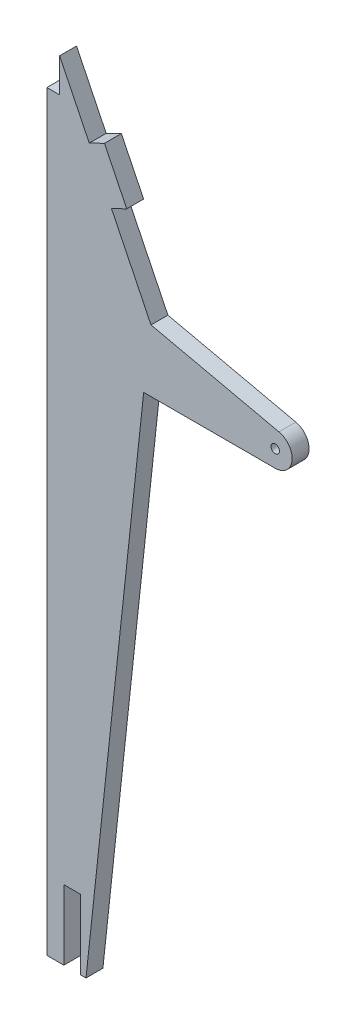
ISO-10303-21;
HEADER;
FILE_DESCRIPTION(('STEP AP214'),'2;1');
FILE_NAME('part.step','',(''),(''),'','','');
FILE_SCHEMA(('AUTOMOTIVE_DESIGN { 1 0 10303 214 1 1 1 1 }'));
ENDSEC;
DATA;
#1=APPLICATION_CONTEXT('core data for automotive mechanical design processes');
#2=APPLICATION_PROTOCOL_DEFINITION('international standard','automotive_design',2000,#1);
#3=PRODUCT_CONTEXT('',#1,'mechanical');
#4=PRODUCT('Part','Part','',(#3));
#5=PRODUCT_RELATED_PRODUCT_CATEGORY('part','',(#4));
#6=PRODUCT_DEFINITION_FORMATION('','',#4);
#7=PRODUCT_DEFINITION_CONTEXT('part definition',#1,'design');
#8=PRODUCT_DEFINITION('design','',#6,#7);
#9=PRODUCT_DEFINITION_SHAPE('','',#8);
#10=(LENGTH_UNIT() NAMED_UNIT(*) SI_UNIT(.MILLI.,.METRE.));
#11=(NAMED_UNIT(*) PLANE_ANGLE_UNIT() SI_UNIT($,.RADIAN.));
#12=(NAMED_UNIT(*) SI_UNIT($,.STERADIAN.) SOLID_ANGLE_UNIT());
#13=UNCERTAINTY_MEASURE_WITH_UNIT(LENGTH_MEASURE(1.E-05),#10,'distance_accuracy_value','');
#14=(GEOMETRIC_REPRESENTATION_CONTEXT(3) GLOBAL_UNCERTAINTY_ASSIGNED_CONTEXT((#13)) GLOBAL_UNIT_ASSIGNED_CONTEXT((#10,
#11,#12)) REPRESENTATION_CONTEXT('',''));
#15=CARTESIAN_POINT('',(0.,0.,0.));
#16=DIRECTION('',(0.,0.,1.));
#17=DIRECTION('',(1.,0.,0.));
#18=AXIS2_PLACEMENT_3D('',#15,#16,#17);
#19=CARTESIAN_POINT('',(2.02153398630261E-12,68.6805644708877,2.));
#20=DIRECTION('',(0.,-1.,0.));
#21=DIRECTION('',(1.,0.,0.));
#22=AXIS2_PLACEMENT_3D('',#19,#20,#21);
#23=PLANE('',#22);
#24=DIRECTION('',(-1.,0.,0.));
#25=VECTOR('',#24,1.);
#26=CARTESIAN_POINT('',(2.02153398630261E-12,68.6805644708877,0.));
#27=LINE('',#26,#25);
#28=CARTESIAN_POINT('',(37.0653861032624,68.6805644708866,0.));
#29=VERTEX_POINT('',#28);
#30=CARTESIAN_POINT('',(21.506195844132,68.680564470887,0.));
#31=VERTEX_POINT('',#30);
#32=EDGE_CURVE('E228',#29,#31,#27,.T.);
#33=ORIENTED_EDGE('',*,*,#32,.F.);
#34=DIRECTION('',(0.,0.,-1.));
#35=VECTOR('',#34,1.);
#36=CARTESIAN_POINT('',(37.0653861032624,68.6805644708866,2.));
#37=LINE('',#36,#35);
#38=CARTESIAN_POINT('',(37.0653861032624,68.6805644708866,2.));
#39=VERTEX_POINT('',#38);
#40=EDGE_CURVE('E11',#39,#29,#37,.T.);
#41=ORIENTED_EDGE('',*,*,#40,.F.);
#42=DIRECTION('',(-1.,0.,0.));
#43=VECTOR('',#42,1.);
#44=CARTESIAN_POINT('',(2.02153398630261E-12,68.6805644708877,2.));
#45=LINE('',#44,#43);
#46=CARTESIAN_POINT('',(21.506195844132,68.680564470887,2.));
#47=VERTEX_POINT('',#46);
#48=EDGE_CURVE('E543',#39,#47,#45,.T.);
#49=ORIENTED_EDGE('',*,*,#48,.T.);
#50=DIRECTION('',(0.,0.,-1.));
#51=VECTOR('',#50,1.);
#52=CARTESIAN_POINT('',(21.506195844132,68.680564470887,2.));
#53=LINE('',#52,#51);
#54=EDGE_CURVE('E54',#47,#31,#53,.T.);
#55=ORIENTED_EDGE('',*,*,#54,.T.);
#56=EDGE_LOOP('',(#33,#41,#49,#55));
#57=FACE_BOUND('',#56,.T.);
#58=ADVANCED_FACE('F37',(#57),#23,.T.);
#59=CARTESIAN_POINT('',(37.0653861032624,70.6805644708866,2.));
#60=DIRECTION('',(0.,0.,-1.));
#61=DIRECTION('',(-1.,0.,0.));
#62=AXIS2_PLACEMENT_3D('',#59,#60,#61);
#63=CYLINDRICAL_SURFACE('',#62,2.);
#64=CARTESIAN_POINT('',(37.0653861032624,70.6805644708866,0.));
#65=DIRECTION('',(0.,0.,1.));
#66=DIRECTION('',(1.,0.,0.));
#67=AXIS2_PLACEMENT_3D('',#64,#65,#66);
#68=CIRCLE('',#67,2.);
#69=CARTESIAN_POINT('',(37.5026056794359,72.6321891894763,0.));
#70=VERTEX_POINT('',#69);
#71=EDGE_CURVE('E225',#29,#70,#68,.T.);
#72=ORIENTED_EDGE('',*,*,#71,.T.);
#73=DIRECTION('',(0.,0.,-1.));
#74=VECTOR('',#73,1.);
#75=CARTESIAN_POINT('',(37.5026056794359,72.6321891894763,2.));
#76=LINE('',#75,#74);
#77=CARTESIAN_POINT('',(37.5026056794359,72.6321891894763,2.));
#78=VERTEX_POINT('',#77);
#79=EDGE_CURVE('E46',#78,#70,#76,.T.);
#80=ORIENTED_EDGE('',*,*,#79,.F.);
#81=CARTESIAN_POINT('',(37.0653861032624,70.6805644708866,2.));
#82=DIRECTION('',(0.,0.,1.));
#83=DIRECTION('',(1.,0.,0.));
#84=AXIS2_PLACEMENT_3D('',#81,#82,#83);
#85=CIRCLE('',#84,2.);
#86=EDGE_CURVE('E540',#39,#78,#85,.T.);
#87=ORIENTED_EDGE('',*,*,#86,.F.);
#88=ORIENTED_EDGE('',*,*,#40,.T.);
#89=EDGE_LOOP('',(#72,#80,#87,#88));
#90=FACE_BOUND('',#89,.T.);
#91=ADVANCED_FACE('F226',(#90),#63,.T.);
#92=CARTESIAN_POINT('',(17.286312033324,77.161215316043,2.));
#93=DIRECTION('',(0.218609788086619,0.975812359294923,0.));
#94=DIRECTION('',(-0.975812359294923,0.218609788086619,0.));
#95=AXIS2_PLACEMENT_3D('',#92,#93,#94);
#96=PLANE('',#95);
#97=DIRECTION('',(0.975812359294923,-0.218609788086619,0.));
#98=VECTOR('',#97,1.);
#99=CARTESIAN_POINT('',(17.286312033324,77.161215316043,0.));
#100=LINE('',#99,#98);
#101=CARTESIAN_POINT('',(22.3730109435082,76.0216497425763,0.));
#102=VERTEX_POINT('',#101);
#103=EDGE_CURVE('E219',#102,#70,#100,.T.);
#104=ORIENTED_EDGE('',*,*,#103,.F.);
#105=DIRECTION('',(0.,0.,-1.));
#106=VECTOR('',#105,1.);
#107=CARTESIAN_POINT('',(22.3730109435082,76.0216497425763,2.));
#108=LINE('',#107,#106);
#109=CARTESIAN_POINT('',(22.3730109435082,76.0216497425763,2.));
#110=VERTEX_POINT('',#109);
#111=EDGE_CURVE('E211',#110,#102,#108,.T.);
#112=ORIENTED_EDGE('',*,*,#111,.F.);
#113=DIRECTION('',(0.975812359294923,-0.218609788086619,0.));
#114=VECTOR('',#113,1.);
#115=CARTESIAN_POINT('',(17.286312033324,77.161215316043,2.));
#116=LINE('',#115,#114);
#117=EDGE_CURVE('E222',#110,#78,#116,.T.);
#118=ORIENTED_EDGE('',*,*,#117,.T.);
#119=ORIENTED_EDGE('',*,*,#79,.T.);
#120=EDGE_LOOP('',(#104,#112,#118,#119));
#121=FACE_BOUND('',#120,.T.);
#122=ADVANCED_FACE('F217',(#121),#96,.T.);
#123=CARTESIAN_POINT('',(48.0265446862717,23.4241109597134,2.));
#124=DIRECTION('',(0.898794046299137,0.438371146789139,0.));
#125=DIRECTION('',(-0.438371146789139,0.898794046299137,0.));
#126=AXIS2_PLACEMENT_3D('',#123,#124,#125);
#127=PLANE('',#126);
#128=DIRECTION('',(0.438371146789139,-0.898794046299137,0.));
#129=VECTOR('',#128,1.);
#130=CARTESIAN_POINT('',(48.0265446862717,23.4241109597134,0.));
#131=LINE('',#130,#129);
#132=CARTESIAN_POINT('',(17.7025821583084,85.5974478226967,0.));
#133=VERTEX_POINT('',#132);
#134=EDGE_CURVE('E233',#133,#102,#131,.T.);
#135=ORIENTED_EDGE('',*,*,#134,.F.);
#136=DIRECTION('',(0.,0.,-1.));
#137=VECTOR('',#136,1.);
#138=CARTESIAN_POINT('',(17.7025821583084,85.5974478226967,2.));
#139=LINE('',#138,#137);
#140=CARTESIAN_POINT('',(17.7025821583084,85.5974478226967,2.));
#141=VERTEX_POINT('',#140);
#142=EDGE_CURVE('E209',#141,#133,#139,.T.);
#143=ORIENTED_EDGE('',*,*,#142,.F.);
#144=DIRECTION('',(0.438371146789139,-0.898794046299137,0.));
#145=VECTOR('',#144,1.);
#146=CARTESIAN_POINT('',(48.0265446862717,23.4241109597134,2.));
#147=LINE('',#146,#145);
#148=EDGE_CURVE('E539',#141,#110,#147,.T.);
#149=ORIENTED_EDGE('',*,*,#148,.T.);
#150=ORIENTED_EDGE('',*,*,#111,.T.);
#151=EDGE_LOOP('',(#135,#143,#149,#150));
#152=FACE_BOUND('',#151,.T.);
#153=ADVANCED_FACE('F297',(#152),#127,.T.);
#154=CARTESIAN_POINT('',(-30.3239625279556,62.1733368630016,2.));
#155=DIRECTION('',(0.43837114678892,-0.898794046299244,0.));
#156=DIRECTION('',(0.898794046299244,0.43837114678892,0.));
#157=AXIS2_PLACEMENT_3D('',#154,#155,#156);
#158=PLANE('',#157);
#159=DIRECTION('',(-0.898794046299244,-0.43837114678892,0.));
#160=VECTOR('',#159,1.);
#161=CARTESIAN_POINT('',(-30.3239625279556,62.1733368630016,0.));
#162=LINE('',#161,#160);
#163=CARTESIAN_POINT('',(19.5001702509053,86.4741901162738,0.));
#164=VERTEX_POINT('',#163);
#165=EDGE_CURVE('E235',#164,#133,#162,.T.);
#166=ORIENTED_EDGE('',*,*,#165,.F.);
#167=DIRECTION('',(0.,0.,-1.));
#168=VECTOR('',#167,1.);
#169=CARTESIAN_POINT('',(19.5001702509053,86.4741901162738,2.));
#170=LINE('',#169,#168);
#171=CARTESIAN_POINT('',(19.5001702509053,86.4741901162738,2.));
#172=VERTEX_POINT('',#171);
#173=EDGE_CURVE('E207',#172,#164,#170,.T.);
#174=ORIENTED_EDGE('',*,*,#173,.F.);
#175=DIRECTION('',(-0.898794046299244,-0.43837114678892,0.));
#176=VECTOR('',#175,1.);
#177=CARTESIAN_POINT('',(-30.3239625279556,62.1733368630016,2.));
#178=LINE('',#177,#176);
#179=EDGE_CURVE('E536',#172,#141,#178,.T.);
#180=ORIENTED_EDGE('',*,*,#179,.T.);
#181=ORIENTED_EDGE('',*,*,#142,.T.);
#182=EDGE_LOOP('',(#166,#174,#180,#181));
#183=FACE_BOUND('',#182,.T.);
#184=ADVANCED_FACE('F300',(#183),#158,.T.);
#185=CARTESIAN_POINT('',(49.824132778869,24.3008532532894,2.));
#186=DIRECTION('',(0.89879404629915,0.438371146789113,0.));
#187=DIRECTION('',(-0.438371146789113,0.89879404629915,0.));
#188=AXIS2_PLACEMENT_3D('',#185,#186,#187);
#189=PLANE('',#188);
#190=DIRECTION('',(0.438371146789113,-0.89879404629915,0.));
#191=VECTOR('',#190,1.);
#192=CARTESIAN_POINT('',(49.824132778869,24.3008532532894,0.));
#193=LINE('',#192,#191);
#194=CARTESIAN_POINT('',(16.8699433701704,91.8669543940691,0.));
#195=VERTEX_POINT('',#194);
#196=EDGE_CURVE('E240',#195,#164,#193,.T.);
#197=ORIENTED_EDGE('',*,*,#196,.F.);
#198=DIRECTION('',(0.,0.,-1.));
#199=VECTOR('',#198,1.);
#200=CARTESIAN_POINT('',(16.8699433701704,91.8669543940691,2.));
#201=LINE('',#200,#199);
#202=CARTESIAN_POINT('',(16.8699433701704,91.8669543940691,2.));
#203=VERTEX_POINT('',#202);
#204=EDGE_CURVE('E205',#203,#195,#201,.T.);
#205=ORIENTED_EDGE('',*,*,#204,.F.);
#206=DIRECTION('',(0.438371146789113,-0.89879404629915,0.));
#207=VECTOR('',#206,1.);
#208=CARTESIAN_POINT('',(49.824132778869,24.3008532532894,2.));
#209=LINE('',#208,#207);
#210=EDGE_CURVE('E533',#203,#172,#209,.T.);
#211=ORIENTED_EDGE('',*,*,#210,.T.);
#212=ORIENTED_EDGE('',*,*,#173,.T.);
#213=EDGE_LOOP('',(#197,#205,#211,#212));
#214=FACE_BOUND('',#213,.T.);
#215=ADVANCED_FACE('F304',(#214),#189,.T.);
#216=CARTESIAN_POINT('',(-32.9541894086893,67.5661011407974,2.));
#217=DIRECTION('',(-0.438371146788921,0.898794046299244,0.));
#218=DIRECTION('',(-0.898794046299244,-0.438371146788921,0.));
#219=AXIS2_PLACEMENT_3D('',#216,#217,#218);
#220=PLANE('',#219);
#221=DIRECTION('',(0.898794046299244,0.438371146788921,0.));
#222=VECTOR('',#221,1.);
#223=CARTESIAN_POINT('',(-32.9541894086893,67.5661011407974,0.));
#224=LINE('',#223,#222);
#225=CARTESIAN_POINT('',(15.0723552775735,90.990212100492,0.));
#226=VERTEX_POINT('',#225);
#227=EDGE_CURVE('E243',#226,#195,#224,.T.);
#228=ORIENTED_EDGE('',*,*,#227,.F.);
#229=DIRECTION('',(0.,0.,-1.));
#230=VECTOR('',#229,1.);
#231=CARTESIAN_POINT('',(15.0723552775735,90.990212100492,2.));
#232=LINE('',#231,#230);
#233=CARTESIAN_POINT('',(15.0723552775735,90.990212100492,2.));
#234=VERTEX_POINT('',#233);
#235=EDGE_CURVE('E203',#234,#226,#232,.T.);
#236=ORIENTED_EDGE('',*,*,#235,.F.);
#237=DIRECTION('',(0.898794046299244,0.438371146788921,0.));
#238=VECTOR('',#237,1.);
#239=CARTESIAN_POINT('',(-32.9541894086893,67.5661011407974,2.));
#240=LINE('',#239,#238);
#241=EDGE_CURVE('E529',#234,#203,#240,.T.);
#242=ORIENTED_EDGE('',*,*,#241,.T.);
#243=ORIENTED_EDGE('',*,*,#204,.T.);
#244=EDGE_LOOP('',(#228,#236,#242,#243));
#245=FACE_BOUND('',#244,.T.);
#246=ADVANCED_FACE('F308',(#245),#220,.T.);
#247=CARTESIAN_POINT('',(48.026544686261,23.4241109596912,2.));
#248=DIRECTION('',(0.898794046299262,0.438371146788883,0.));
#249=DIRECTION('',(-0.438371146788883,0.898794046299262,0.));
#250=AXIS2_PLACEMENT_3D('',#247,#248,#249);
#251=PLANE('',#250);
#252=DIRECTION('',(0.438371146788883,-0.898794046299262,0.));
#253=VECTOR('',#252,1.);
#254=CARTESIAN_POINT('',(48.026544686261,23.4241109596912,0.));
#255=LINE('',#254,#253);
#256=CARTESIAN_POINT('',(11.5653861032624,98.1805644708861,0.));
#257=VERTEX_POINT('',#256);
#258=EDGE_CURVE('E246',#257,#226,#255,.T.);
#259=ORIENTED_EDGE('',*,*,#258,.F.);
#260=DIRECTION('',(0.,0.,-1.));
#261=VECTOR('',#260,1.);
#262=CARTESIAN_POINT('',(11.5653861032624,98.1805644708861,2.));
#263=LINE('',#262,#261);
#264=CARTESIAN_POINT('',(11.5653861032624,98.1805644708861,2.));
#265=VERTEX_POINT('',#264);
#266=EDGE_CURVE('E201',#265,#257,#263,.T.);
#267=ORIENTED_EDGE('',*,*,#266,.F.);
#268=DIRECTION('',(0.438371146788883,-0.898794046299262,0.));
#269=VECTOR('',#268,1.);
#270=CARTESIAN_POINT('',(48.026544686261,23.4241109596912,2.));
#271=LINE('',#270,#269);
#272=EDGE_CURVE('E524',#265,#234,#271,.T.);
#273=ORIENTED_EDGE('',*,*,#272,.T.);
#274=ORIENTED_EDGE('',*,*,#235,.T.);
#275=EDGE_LOOP('',(#259,#267,#273,#274));
#276=FACE_BOUND('',#275,.T.);
#277=ADVANCED_FACE('F312',(#276),#251,.T.);
#278=CARTESIAN_POINT('',(11.5653861032624,0.,2.));
#279=DIRECTION('',(1.,0.,0.));
#280=DIRECTION('',(0.,0.,-1.));
#281=AXIS2_PLACEMENT_3D('',#278,#279,#280);
#282=PLANE('',#281);
#283=DIRECTION('',(0.,-1.,0.));
#284=VECTOR('',#283,1.);
#285=CARTESIAN_POINT('',(11.5653861032624,0.,0.));
#286=LINE('',#285,#284);
#287=CARTESIAN_POINT('',(11.5653861032624,94.1805644708861,0.));
#288=VERTEX_POINT('',#287);
#289=EDGE_CURVE('E249',#257,#288,#286,.T.);
#290=ORIENTED_EDGE('',*,*,#289,.T.);
#291=DIRECTION('',(0.,0.,-1.));
#292=VECTOR('',#291,1.);
#293=CARTESIAN_POINT('',(11.5653861032624,94.1805644708861,2.));
#294=LINE('',#293,#292);
#295=CARTESIAN_POINT('',(11.5653861032624,94.1805644708861,2.));
#296=VERTEX_POINT('',#295);
#297=EDGE_CURVE('E198',#296,#288,#294,.T.);
#298=ORIENTED_EDGE('',*,*,#297,.F.);
#299=DIRECTION('',(0.,-1.,0.));
#300=VECTOR('',#299,1.);
#301=CARTESIAN_POINT('',(11.5653861032624,0.,2.));
#302=LINE('',#301,#300);
#303=EDGE_CURVE('E521',#265,#296,#302,.T.);
#304=ORIENTED_EDGE('',*,*,#303,.F.);
#305=ORIENTED_EDGE('',*,*,#266,.T.);
#306=EDGE_LOOP('',(#290,#298,#304,#305));
#307=FACE_BOUND('',#306,.T.);
#308=ADVANCED_FACE('F316',(#307),#282,.F.);
#309=CARTESIAN_POINT('',(0.,94.1805644708861,2.));
#310=DIRECTION('',(0.,-1.,0.));
#311=DIRECTION('',(0.,0.,-1.));
#312=AXIS2_PLACEMENT_3D('',#309,#310,#311);
#313=PLANE('',#312);
#314=DIRECTION('',(-1.,0.,0.));
#315=VECTOR('',#314,1.);
#316=CARTESIAN_POINT('',(0.,94.1805644708861,0.));
#317=LINE('',#316,#315);
#318=CARTESIAN_POINT('',(10.0653861032624,94.1805644708861,0.));
#319=VERTEX_POINT('',#318);
#320=EDGE_CURVE('E252',#288,#319,#317,.T.);
#321=ORIENTED_EDGE('',*,*,#320,.T.);
#322=DIRECTION('',(0.,0.,-1.));
#323=VECTOR('',#322,1.);
#324=CARTESIAN_POINT('',(10.0653861032624,94.1805644708861,2.));
#325=LINE('',#324,#323);
#326=CARTESIAN_POINT('',(10.0653861032624,94.1805644708861,2.));
#327=VERTEX_POINT('',#326);
#328=EDGE_CURVE('E195',#327,#319,#325,.T.);
#329=ORIENTED_EDGE('',*,*,#328,.F.);
#330=DIRECTION('',(-1.,0.,0.));
#331=VECTOR('',#330,1.);
#332=CARTESIAN_POINT('',(0.,94.1805644708861,2.));
#333=LINE('',#332,#331);
#334=EDGE_CURVE('E518',#296,#327,#333,.T.);
#335=ORIENTED_EDGE('',*,*,#334,.F.);
#336=ORIENTED_EDGE('',*,*,#297,.T.);
#337=EDGE_LOOP('',(#321,#329,#335,#336));
#338=FACE_BOUND('',#337,.T.);
#339=ADVANCED_FACE('F320',(#338),#313,.F.);
#340=CARTESIAN_POINT('',(10.0653861032624,0.,2.));
#341=DIRECTION('',(1.,0.,0.));
#342=DIRECTION('',(0.,0.,-1.));
#343=AXIS2_PLACEMENT_3D('',#340,#341,#342);
#344=PLANE('',#343);
#345=DIRECTION('',(0.,-1.,0.));
#346=VECTOR('',#345,1.);
#347=CARTESIAN_POINT('',(10.0653861032624,0.,0.));
#348=LINE('',#347,#346);
#349=CARTESIAN_POINT('',(10.0653861032624,5.29784771058576,0.));
#350=VERTEX_POINT('',#349);
#351=EDGE_CURVE('E255',#319,#350,#348,.T.);
#352=ORIENTED_EDGE('',*,*,#351,.T.);
#353=DIRECTION('',(0.,0.,-1.));
#354=VECTOR('',#353,1.);
#355=CARTESIAN_POINT('',(10.0653861032624,5.29784771058576,2.));
#356=LINE('',#355,#354);
#357=CARTESIAN_POINT('',(10.0653861032624,5.29784771058576,2.));
#358=VERTEX_POINT('',#357);
#359=EDGE_CURVE('E192',#358,#350,#356,.T.);
#360=ORIENTED_EDGE('',*,*,#359,.F.);
#361=DIRECTION('',(0.,-1.,0.));
#362=VECTOR('',#361,1.);
#363=CARTESIAN_POINT('',(10.0653861032624,0.,2.));
#364=LINE('',#363,#362);
#365=EDGE_CURVE('E553',#327,#358,#364,.T.);
#366=ORIENTED_EDGE('',*,*,#365,.F.);
#367=ORIENTED_EDGE('',*,*,#328,.T.);
#368=EDGE_LOOP('',(#352,#360,#366,#367));
#369=FACE_BOUND('',#368,.T.);
#370=ADVANCED_FACE('F324',(#369),#344,.F.);
#371=CARTESIAN_POINT('',(0.,5.29784771058576,2.));
#372=DIRECTION('',(0.,1.,0.));
#373=DIRECTION('',(0.,0.,1.));
#374=AXIS2_PLACEMENT_3D('',#371,#372,#373);
#375=PLANE('',#374);
#376=DIRECTION('',(1.,0.,0.));
#377=VECTOR('',#376,1.);
#378=CARTESIAN_POINT('',(0.,5.29784771058576,0.));
#379=LINE('',#378,#377);
#380=CARTESIAN_POINT('',(12.0653861032633,5.29784771058576,0.));
#381=VERTEX_POINT('',#380);
#382=EDGE_CURVE('E258',#350,#381,#379,.T.);
#383=ORIENTED_EDGE('',*,*,#382,.T.);
#384=DIRECTION('',(0.,0.,-1.));
#385=VECTOR('',#384,1.);
#386=CARTESIAN_POINT('',(12.0653861032633,5.29784771058576,2.));
#387=LINE('',#386,#385);
#388=CARTESIAN_POINT('',(12.0653861032633,5.29784771058576,2.));
#389=VERTEX_POINT('',#388);
#390=EDGE_CURVE('E189',#389,#381,#387,.T.);
#391=ORIENTED_EDGE('',*,*,#390,.F.);
#392=DIRECTION('',(1.,0.,0.));
#393=VECTOR('',#392,1.);
#394=CARTESIAN_POINT('',(0.,5.29784771058576,2.));
#395=LINE('',#394,#393);
#396=EDGE_CURVE('E511',#358,#389,#395,.T.);
#397=ORIENTED_EDGE('',*,*,#396,.F.);
#398=ORIENTED_EDGE('',*,*,#359,.T.);
#399=EDGE_LOOP('',(#383,#391,#397,#398));
#400=FACE_BOUND('',#399,.T.);
#401=ADVANCED_FACE('F328',(#400),#375,.F.);
#402=CARTESIAN_POINT('',(12.0653861032633,0.,2.));
#403=DIRECTION('',(-1.,0.,0.));
#404=DIRECTION('',(0.,0.,1.));
#405=AXIS2_PLACEMENT_3D('',#402,#403,#404);
#406=PLANE('',#405);
#407=DIRECTION('',(0.,1.,0.));
#408=VECTOR('',#407,1.);
#409=CARTESIAN_POINT('',(12.0653861032633,0.,0.));
#410=LINE('',#409,#408);
#411=CARTESIAN_POINT('',(12.0653861032633,13.5478477105967,0.));
#412=VERTEX_POINT('',#411);
#413=EDGE_CURVE('E261',#381,#412,#410,.T.);
#414=ORIENTED_EDGE('',*,*,#413,.T.);
#415=DIRECTION('',(0.,0.,-1.));
#416=VECTOR('',#415,1.);
#417=CARTESIAN_POINT('',(12.0653861032633,13.5478477105967,2.));
#418=LINE('',#417,#416);
#419=CARTESIAN_POINT('',(12.0653861032633,13.5478477105967,2.));
#420=VERTEX_POINT('',#419);
#421=EDGE_CURVE('E182',#420,#412,#418,.T.);
#422=ORIENTED_EDGE('',*,*,#421,.F.);
#423=DIRECTION('',(0.,1.,0.));
#424=VECTOR('',#423,1.);
#425=CARTESIAN_POINT('',(12.0653861032633,0.,2.));
#426=LINE('',#425,#424);
#427=EDGE_CURVE('E508',#389,#420,#426,.T.);
#428=ORIENTED_EDGE('',*,*,#427,.F.);
#429=ORIENTED_EDGE('',*,*,#390,.T.);
#430=EDGE_LOOP('',(#414,#422,#428,#429));
#431=FACE_BOUND('',#430,.T.);
#432=ADVANCED_FACE('F332',(#431),#406,.F.);
#433=CARTESIAN_POINT('',(0.,13.5478477105967,2.));
#434=DIRECTION('',(0.,1.,0.));
#435=DIRECTION('',(0.,0.,1.));
#436=AXIS2_PLACEMENT_3D('',#433,#434,#435);
#437=PLANE('',#436);
#438=DIRECTION('',(1.,0.,0.));
#439=VECTOR('',#438,1.);
#440=CARTESIAN_POINT('',(0.,13.5478477105967,0.));
#441=LINE('',#440,#439);
#442=CARTESIAN_POINT('',(14.0653861032633,13.5478477105967,0.));
#443=VERTEX_POINT('',#442);
#444=EDGE_CURVE('E264',#412,#443,#441,.T.);
#445=ORIENTED_EDGE('',*,*,#444,.T.);
#446=DIRECTION('',(0.,0.,-1.));
#447=VECTOR('',#446,1.);
#448=CARTESIAN_POINT('',(14.0653861032633,13.5478477105967,2.));
#449=LINE('',#448,#447);
#450=CARTESIAN_POINT('',(14.0653861032633,13.5478477105967,2.));
#451=VERTEX_POINT('',#450);
#452=EDGE_CURVE('E180',#451,#443,#449,.T.);
#453=ORIENTED_EDGE('',*,*,#452,.F.);
#454=DIRECTION('',(1.,0.,0.));
#455=VECTOR('',#454,1.);
#456=CARTESIAN_POINT('',(0.,13.5478477105967,2.));
#457=LINE('',#456,#455);
#458=EDGE_CURVE('E173',#420,#451,#457,.T.);
#459=ORIENTED_EDGE('',*,*,#458,.F.);
#460=ORIENTED_EDGE('',*,*,#421,.T.);
#461=EDGE_LOOP('',(#445,#453,#459,#460));
#462=FACE_BOUND('',#461,.T.);
#463=ADVANCED_FACE('F336',(#462),#437,.F.);
#464=CARTESIAN_POINT('',(14.0653861032633,0.,2.));
#465=DIRECTION('',(1.,0.,0.));
#466=DIRECTION('',(0.,0.,-1.));
#467=AXIS2_PLACEMENT_3D('',#464,#465,#466);
#468=PLANE('',#467);
#469=DIRECTION('',(0.,-1.,0.));
#470=VECTOR('',#469,1.);
#471=CARTESIAN_POINT('',(14.0653861032633,0.,0.));
#472=LINE('',#471,#470);
#473=CARTESIAN_POINT('',(14.0653861032633,5.29784771058576,0.));
#474=VERTEX_POINT('',#473);
#475=EDGE_CURVE('E179',#443,#474,#472,.T.);
#476=ORIENTED_EDGE('',*,*,#475,.T.);
#477=DIRECTION('',(0.,0.,-1.));
#478=VECTOR('',#477,1.);
#479=CARTESIAN_POINT('',(14.0653861032633,5.29784771058576,2.));
#480=LINE('',#479,#478);
#481=CARTESIAN_POINT('',(14.0653861032633,5.29784771058576,2.));
#482=VERTEX_POINT('',#481);
#483=EDGE_CURVE('E162',#482,#474,#480,.T.);
#484=ORIENTED_EDGE('',*,*,#483,.F.);
#485=DIRECTION('',(0.,-1.,0.));
#486=VECTOR('',#485,1.);
#487=CARTESIAN_POINT('',(14.0653861032633,0.,2.));
#488=LINE('',#487,#486);
#489=EDGE_CURVE('E167',#451,#482,#488,.T.);
#490=ORIENTED_EDGE('',*,*,#489,.F.);
#491=ORIENTED_EDGE('',*,*,#452,.T.);
#492=EDGE_LOOP('',(#476,#484,#490,#491));
#493=FACE_BOUND('',#492,.T.);
#494=ADVANCED_FACE('F178',(#493),#468,.F.);
#495=CARTESIAN_POINT('',(0.,5.29784771058576,2.));
#496=DIRECTION('',(0.,1.,0.));
#497=DIRECTION('',(0.,0.,1.));
#498=AXIS2_PLACEMENT_3D('',#495,#496,#497);
#499=PLANE('',#498);
#500=DIRECTION('',(1.,0.,0.));
#501=VECTOR('',#500,1.);
#502=CARTESIAN_POINT('',(0.,5.29784771058576,0.));
#503=LINE('',#502,#501);
#504=CARTESIAN_POINT('',(14.6863632947425,5.29784771058576,0.));
#505=VERTEX_POINT('',#504);
#506=EDGE_CURVE('E268',#474,#505,#503,.T.);
#507=ORIENTED_EDGE('',*,*,#506,.T.);
#508=DIRECTION('',(0.,0.,-1.));
#509=VECTOR('',#508,1.);
#510=CARTESIAN_POINT('',(14.6863632947425,5.29784771058576,2.));
#511=LINE('',#510,#509);
#512=CARTESIAN_POINT('',(14.6863632947425,5.29784771058576,2.));
#513=VERTEX_POINT('',#512);
#514=EDGE_CURVE('E107',#513,#505,#511,.T.);
#515=ORIENTED_EDGE('',*,*,#514,.F.);
#516=DIRECTION('',(1.,0.,0.));
#517=VECTOR('',#516,1.);
#518=CARTESIAN_POINT('',(0.,5.29784771058576,2.));
#519=LINE('',#518,#517);
#520=EDGE_CURVE('E158',#482,#513,#519,.T.);
#521=ORIENTED_EDGE('',*,*,#520,.F.);
#522=ORIENTED_EDGE('',*,*,#483,.T.);
#523=EDGE_LOOP('',(#507,#515,#521,#522));
#524=FACE_BOUND('',#523,.T.);
#525=ADVANCED_FACE('F160',(#524),#499,.F.);
#526=CARTESIAN_POINT('',(37.0653861032624,70.6805644708866,2.));
#527=DIRECTION('',(0.,0.,-1.));
#528=DIRECTION('',(-1.,0.,0.));
#529=AXIS2_PLACEMENT_3D('',#526,#527,#528);
#530=CYLINDRICAL_SURFACE('',#529,0.5);
#531=CARTESIAN_POINT('',(37.0653861032624,70.6805644708866,2.));
#532=DIRECTION('',(0.,0.,1.));
#533=DIRECTION('',(1.,0.,0.));
#534=AXIS2_PLACEMENT_3D('',#531,#532,#533);
#535=CIRCLE('',#534,0.5);
#536=CARTESIAN_POINT('',(37.5653861032624,70.6805644708866,2.));
#537=VERTEX_POINT('',#536);
#538=EDGE_CURVE('E272',#537,#537,#535,.T.);
#539=ORIENTED_EDGE('',*,*,#538,.T.);
#540=EDGE_LOOP('',(#539));
#541=FACE_BOUND('',#540,.T.);
#542=CARTESIAN_POINT('',(37.0653861032624,70.6805644708866,0.));
#543=DIRECTION('',(0.,0.,1.));
#544=DIRECTION('',(1.,0.,0.));
#545=AXIS2_PLACEMENT_3D('',#542,#543,#544);
#546=CIRCLE('',#545,0.5);
#547=CARTESIAN_POINT('',(37.5653861032624,70.6805644708866,0.));
#548=VERTEX_POINT('',#547);
#549=EDGE_CURVE('E275',#548,#548,#546,.T.);
#550=ORIENTED_EDGE('',*,*,#549,.F.);
#551=EDGE_LOOP('',(#550));
#552=FACE_BOUND('',#551,.T.);
#553=ADVANCED_FACE('F39',(#541,#552),#530,.F.);
#554=CARTESIAN_POINT('',(13.9547692648205,-1.50150063796335,2.));
#555=DIRECTION('',(0.994261153147758,-0.106980182002511,0.));
#556=DIRECTION('',(0.106980182002511,0.994261153147758,0.));
#557=AXIS2_PLACEMENT_3D('',#554,#555,#556);
#558=PLANE('',#557);
#559=DIRECTION('',(-0.106980182002511,-0.994261153147758,0.));
#560=VECTOR('',#559,1.);
#561=CARTESIAN_POINT('',(13.9547692648205,-1.50150063796335,0.));
#562=LINE('',#561,#560);
#563=EDGE_CURVE('E270',#31,#505,#562,.T.);
#564=ORIENTED_EDGE('',*,*,#563,.F.);
#565=ORIENTED_EDGE('',*,*,#54,.F.);
#566=DIRECTION('',(-0.106980182002511,-0.994261153147758,0.));
#567=VECTOR('',#566,1.);
#568=CARTESIAN_POINT('',(13.9547692648205,-1.50150063796335,2.));
#569=LINE('',#568,#567);
#570=EDGE_CURVE('E166',#47,#513,#569,.T.);
#571=ORIENTED_EDGE('',*,*,#570,.T.);
#572=ORIENTED_EDGE('',*,*,#514,.T.);
#573=EDGE_LOOP('',(#564,#565,#571,#572));
#574=FACE_BOUND('',#573,.T.);
#575=ADVANCED_FACE('F277',(#574),#558,.T.);
#576=CARTESIAN_POINT('',(0.,0.,2.));
#577=DIRECTION('',(0.,0.,1.));
#578=DIRECTION('',(1.,0.,0.));
#579=AXIS2_PLACEMENT_3D('',#576,#577,#578);
#580=PLANE('',#579);
#581=ORIENTED_EDGE('',*,*,#538,.F.);
#582=EDGE_LOOP('',(#581));
#583=FACE_BOUND('',#582,.T.);
#584=ORIENTED_EDGE('',*,*,#48,.F.);
#585=ORIENTED_EDGE('',*,*,#86,.T.);
#586=ORIENTED_EDGE('',*,*,#117,.F.);
#587=ORIENTED_EDGE('',*,*,#148,.F.);
#588=ORIENTED_EDGE('',*,*,#179,.F.);
#589=ORIENTED_EDGE('',*,*,#210,.F.);
#590=ORIENTED_EDGE('',*,*,#241,.F.);
#591=ORIENTED_EDGE('',*,*,#272,.F.);
#592=ORIENTED_EDGE('',*,*,#303,.T.);
#593=ORIENTED_EDGE('',*,*,#334,.T.);
#594=ORIENTED_EDGE('',*,*,#365,.T.);
#595=ORIENTED_EDGE('',*,*,#396,.T.);
#596=ORIENTED_EDGE('',*,*,#427,.T.);
#597=ORIENTED_EDGE('',*,*,#458,.T.);
#598=ORIENTED_EDGE('',*,*,#489,.T.);
#599=ORIENTED_EDGE('',*,*,#520,.T.);
#600=ORIENTED_EDGE('',*,*,#570,.F.);
#601=EDGE_LOOP('',(#584,#585,#586,#587,#588,#589,#590,#591,#592,#593,#594,#595,#596,#597,#598,
#599,#600));
#602=FACE_BOUND('',#601,.T.);
#603=ADVANCED_FACE('F171',(#583,#602),#580,.T.);
#604=CARTESIAN_POINT('',(0.,0.,0.));
#605=DIRECTION('',(0.,0.,1.));
#606=DIRECTION('',(1.,0.,0.));
#607=AXIS2_PLACEMENT_3D('',#604,#605,#606);
#608=PLANE('',#607);
#609=ORIENTED_EDGE('',*,*,#549,.T.);
#610=EDGE_LOOP('',(#609));
#611=FACE_BOUND('',#610,.T.);
#612=ORIENTED_EDGE('',*,*,#32,.T.);
#613=ORIENTED_EDGE('',*,*,#563,.T.);
#614=ORIENTED_EDGE('',*,*,#506,.F.);
#615=ORIENTED_EDGE('',*,*,#475,.F.);
#616=ORIENTED_EDGE('',*,*,#444,.F.);
#617=ORIENTED_EDGE('',*,*,#413,.F.);
#618=ORIENTED_EDGE('',*,*,#382,.F.);
#619=ORIENTED_EDGE('',*,*,#351,.F.);
#620=ORIENTED_EDGE('',*,*,#320,.F.);
#621=ORIENTED_EDGE('',*,*,#289,.F.);
#622=ORIENTED_EDGE('',*,*,#258,.T.);
#623=ORIENTED_EDGE('',*,*,#227,.T.);
#624=ORIENTED_EDGE('',*,*,#196,.T.);
#625=ORIENTED_EDGE('',*,*,#165,.T.);
#626=ORIENTED_EDGE('',*,*,#134,.T.);
#627=ORIENTED_EDGE('',*,*,#103,.T.);
#628=ORIENTED_EDGE('',*,*,#71,.F.);
#629=EDGE_LOOP('',(#612,#613,#614,#615,#616,#617,#618,#619,#620,#621,#622,#623,#624,#625,#626,
#627,#628));
#630=FACE_BOUND('',#629,.T.);
#631=ADVANCED_FACE('F230',(#611,#630),#608,.F.);
#632=CLOSED_SHELL('',(#58,#91,#122,#153,#184,#215,#246,#277,#308,#339,#370,#401,#432,#463,#494,
#525,#553,#575,#603,#631));
#633=MANIFOLD_SOLID_BREP('B2',#632);
#634=ADVANCED_BREP_SHAPE_REPRESENTATION('',(#18,#633),#14);
#635=SHAPE_DEFINITION_REPRESENTATION(#9,#634);
ENDSEC;
END-ISO-10303-21;
